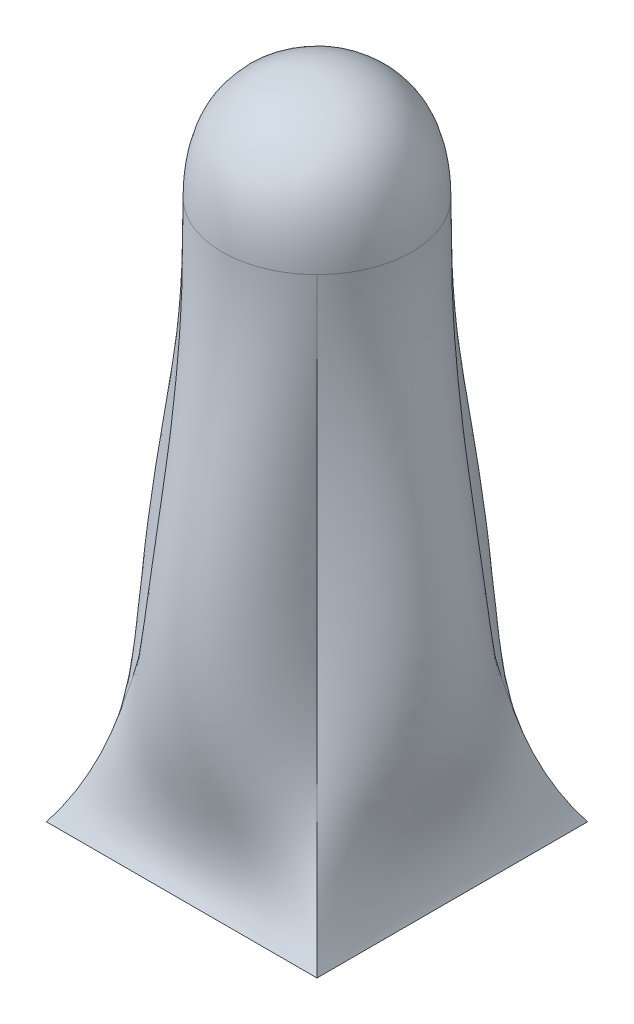
ISO-10303-21;
HEADER;
FILE_DESCRIPTION(('STEP AP214'),'2;1');
FILE_NAME('part.step','',(''),(''),'','','');
FILE_SCHEMA(('AUTOMOTIVE_DESIGN { 1 0 10303 214 1 1 1 1 }'));
ENDSEC;
DATA;
#1=APPLICATION_CONTEXT('core data for automotive mechanical design processes');
#2=APPLICATION_PROTOCOL_DEFINITION('international standard','automotive_design',2000,#1);
#3=PRODUCT_CONTEXT('',#1,'mechanical');
#4=PRODUCT('Part','Part','',(#3));
#5=PRODUCT_RELATED_PRODUCT_CATEGORY('part','',(#4));
#6=PRODUCT_DEFINITION_FORMATION('','',#4);
#7=PRODUCT_DEFINITION_CONTEXT('part definition',#1,'design');
#8=PRODUCT_DEFINITION('design','',#6,#7);
#9=PRODUCT_DEFINITION_SHAPE('','',#8);
#10=(LENGTH_UNIT() NAMED_UNIT(*) SI_UNIT(.MILLI.,.METRE.));
#11=(NAMED_UNIT(*) PLANE_ANGLE_UNIT() SI_UNIT($,.RADIAN.));
#12=(NAMED_UNIT(*) SI_UNIT($,.STERADIAN.) SOLID_ANGLE_UNIT());
#13=UNCERTAINTY_MEASURE_WITH_UNIT(LENGTH_MEASURE(1.E-05),#10,'distance_accuracy_value','');
#14=(GEOMETRIC_REPRESENTATION_CONTEXT(3) GLOBAL_UNCERTAINTY_ASSIGNED_CONTEXT((#13)) GLOBAL_UNIT_ASSIGNED_CONTEXT((#10,
#11,#12)) REPRESENTATION_CONTEXT('',''));
#15=CARTESIAN_POINT('',(0.,0.,0.));
#16=DIRECTION('',(0.,0.,1.));
#17=DIRECTION('',(1.,0.,0.));
#18=AXIS2_PLACEMENT_3D('',#15,#16,#17);
#19=CARTESIAN_POINT('',(0.,0.,0.));
#20=DIRECTION('',(0.,-1.,0.));
#21=DIRECTION('',(0.,0.,-1.));
#22=AXIS2_PLACEMENT_3D('',#19,#20,#21);
#23=PLANE('',#22);
#24=DIRECTION('',(0.,0.,-1.));
#25=VECTOR('',#24,1.);
#26=CARTESIAN_POINT('',(6.35,0.,6.35));
#27=LINE('',#26,#25);
#28=CARTESIAN_POINT('',(6.35,0.,6.35));
#29=VERTEX_POINT('',#28);
#30=CARTESIAN_POINT('',(6.35,0.,-6.35));
#31=VERTEX_POINT('',#30);
#32=EDGE_CURVE('E240',#29,#31,#27,.T.);
#33=ORIENTED_EDGE('',*,*,#32,.F.);
#34=DIRECTION('',(1.,0.,0.));
#35=VECTOR('',#34,1.);
#36=CARTESIAN_POINT('',(-6.35,0.,6.35));
#37=LINE('',#36,#35);
#38=CARTESIAN_POINT('',(-6.35,0.,6.35));
#39=VERTEX_POINT('',#38);
#40=EDGE_CURVE('E223',#39,#29,#37,.T.);
#41=ORIENTED_EDGE('',*,*,#40,.F.);
#42=DIRECTION('',(0.,0.,1.));
#43=VECTOR('',#42,1.);
#44=CARTESIAN_POINT('',(-6.35,0.,6.35));
#45=LINE('',#44,#43);
#46=CARTESIAN_POINT('',(-6.35,0.,-6.35));
#47=VERTEX_POINT('',#46);
#48=EDGE_CURVE('E215',#47,#39,#45,.T.);
#49=ORIENTED_EDGE('',*,*,#48,.F.);
#50=DIRECTION('',(-1.,0.,0.));
#51=VECTOR('',#50,1.);
#52=CARTESIAN_POINT('',(-6.35,0.,-6.35));
#53=LINE('',#52,#51);
#54=EDGE_CURVE('E219',#31,#47,#53,.T.);
#55=ORIENTED_EDGE('',*,*,#54,.F.);
#56=EDGE_LOOP('',(#33,#41,#49,#55));
#57=FACE_BOUND('',#56,.T.);
#58=ADVANCED_FACE('F170',(#57),#23,.T.);
#59=CARTESIAN_POINT('',(6.35,0.,6.35));
#60=CARTESIAN_POINT('',(5.33620582326181,1.5939801367057,5.33620582326182));
#61=CARTESIAN_POINT('',(3.06202655888719,9.88805457372868,3.06202655888719));
#62=CARTESIAN_POINT('',(3.20032044559297,18.527313470039,3.20032044559297));
#63=CARTESIAN_POINT('',(3.14617193349674,25.4,3.14617193349674));
#64=CARTESIAN_POINT('',(6.35,0.,2.11666666666667));
#65=CARTESIAN_POINT('',(5.33620582326182,1.5939801367057,1.77873527442061));
#66=CARTESIAN_POINT('',(10.3210759447851,9.88805457372868,2.52994402734952));
#67=CARTESIAN_POINT('',(4.9367399594886,18.527313470039,1.42780192363319));
#68=CARTESIAN_POINT('',(4.88259144739236,25.4,1.40975241960111));
#69=CARTESIAN_POINT('',(6.35,0.,-2.11666666666667));
#70=CARTESIAN_POINT('',(5.33620582326182,1.5939801367057,-1.77873527442061));
#71=CARTESIAN_POINT('',(10.3210759447851,9.88805457372868,-2.52994402734951));
#72=CARTESIAN_POINT('',(4.9367399594886,18.527313470039,-1.42780192363318));
#73=CARTESIAN_POINT('',(4.88259144739236,25.4,-1.40975241960111));
#74=CARTESIAN_POINT('',(6.35,0.,-6.35));
#75=CARTESIAN_POINT('',(5.33620582326182,1.5939801367057,-5.33620582326181));
#76=CARTESIAN_POINT('',(3.06202655888719,9.88805457372868,-3.06202655888719));
#77=CARTESIAN_POINT('',(3.20032044559297,18.527313470039,-3.20032044559297));
#78=CARTESIAN_POINT('',(3.14617193349674,25.4,-3.14617193349674));
#79=B_SPLINE_SURFACE_WITH_KNOTS('',3,3,((#59,#60,#61,#62,#63),(#64,#65,#66,#67,#68),(#69,#70,
#71,#72,#73),(#74,#75,#76,#77,#78)),.UNSPECIFIED.,.F.,.F.,.F.,(4,4),(4,1,4),(0.,1.),(0.,
0.209240175808596,1.),.UNSPECIFIED.);
#80=CARTESIAN_POINT('',(6.35,0.,-6.35));
#81=CARTESIAN_POINT('',(5.33620582326182,1.5939801367057,-5.33620582326181));
#82=CARTESIAN_POINT('',(3.06202655888719,9.88805457372868,-3.06202655888719));
#83=CARTESIAN_POINT('',(3.20032044559297,18.527313470039,-3.20032044559297));
#84=CARTESIAN_POINT('',(3.14617193349674,25.4,-3.14617193349674));
#85=B_SPLINE_CURVE_WITH_KNOTS('',3,(#80,#81,#82,#83,#84),.UNSPECIFIED.,.F.,.F.,(4,1,4),(0.,
0.209240175808596,1.),.UNSPECIFIED.);
#86=CARTESIAN_POINT('',(3.14617683078582,25.4000267691312,-3.14617682999454));
#87=VERTEX_POINT('',#86);
#88=EDGE_CURVE('E239',#31,#87,#85,.T.);
#89=CARTESIAN_POINT('',(0.,25.4,0.));
#90=DIRECTION('',(0.,1.,0.));
#91=DIRECTION('',(0.,0.,1.));
#92=AXIS2_PLACEMENT_3D('',#89,#90,#91);
#93=CIRCLE('',#92,4.44935901790867);
#94=CARTESIAN_POINT('',(3.14617683013441,25.4000267691422,3.14617683038282));
#95=VERTEX_POINT('',#94);
#96=EDGE_CURVE('E183',#95,#87,#93,.T.);
#97=CARTESIAN_POINT('',(6.35,0.,6.35));
#98=CARTESIAN_POINT('',(5.33620582326181,1.5939801367057,5.33620582326182));
#99=CARTESIAN_POINT('',(3.06202655888719,9.88805457372868,3.06202655888719));
#100=CARTESIAN_POINT('',(3.20032044559297,18.527313470039,3.20032044559297));
#101=CARTESIAN_POINT('',(3.14617193349674,25.4,3.14617193349674));
#102=B_SPLINE_CURVE_WITH_KNOTS('',3,(#97,#98,#99,#100,#101),.UNSPECIFIED.,.F.,.F.,(4,1,4),(0.,
0.209240175808596,1.),.UNSPECIFIED.);
#103=EDGE_CURVE('E249',#95,#29,#102,.F.);
#104=ORIENTED_EDGE('',*,*,#32,.T.);
#105=ORIENTED_EDGE('',*,*,#88,.T.);
#106=ORIENTED_EDGE('',*,*,#96,.F.);
#107=ORIENTED_EDGE('',*,*,#103,.T.);
#108=EDGE_LOOP('',(#104,#105,#106,#107));
#109=FACE_BOUND('',#108,.T.);
#110=ADVANCED_FACE('F302',(#109),#79,.T.);
#111=CARTESIAN_POINT('',(6.35,0.,-6.35));
#112=CARTESIAN_POINT('',(5.33620582326182,1.5939801367057,-5.33620582326181));
#113=CARTESIAN_POINT('',(3.06202655888719,9.88805457372868,-3.06202655888719));
#114=CARTESIAN_POINT('',(3.20032044559297,18.527313470039,-3.20032044559297));
#115=CARTESIAN_POINT('',(3.14617193349674,25.4,-3.14617193349674));
#116=CARTESIAN_POINT('',(2.11666666666667,0.,-6.35));
#117=CARTESIAN_POINT('',(1.77873527442061,1.5939801367057,-5.33620582326182));
#118=CARTESIAN_POINT('',(2.52994402734952,9.88805457372868,-10.3210759447851));
#119=CARTESIAN_POINT('',(1.42780192363319,18.527313470039,-4.9367399594886));
#120=CARTESIAN_POINT('',(1.40975241960111,25.4,-4.88259144739236));
#121=CARTESIAN_POINT('',(-2.11666666666667,0.,-6.35));
#122=CARTESIAN_POINT('',(-1.77873527442061,1.5939801367057,-5.33620582326182));
#123=CARTESIAN_POINT('',(-2.52994402734951,9.88805457372868,-10.3210759447851));
#124=CARTESIAN_POINT('',(-1.42780192363318,18.527313470039,-4.9367399594886));
#125=CARTESIAN_POINT('',(-1.40975241960111,25.4,-4.88259144739236));
#126=CARTESIAN_POINT('',(-6.35,0.,-6.35));
#127=CARTESIAN_POINT('',(-5.33620582326181,1.5939801367057,-5.33620582326182));
#128=CARTESIAN_POINT('',(-3.06202655888719,9.88805457372868,-3.06202655888719));
#129=CARTESIAN_POINT('',(-3.20032044559297,18.527313470039,-3.20032044559297));
#130=CARTESIAN_POINT('',(-3.14617193349674,25.4,-3.14617193349674));
#131=B_SPLINE_SURFACE_WITH_KNOTS('',3,3,((#111,#112,#113,#114,#115),(#116,#117,#118,#119,#120),
(#121,#122,#123,#124,#125),(#126,#127,#128,#129,#130)),.UNSPECIFIED.,.F.,.F.,.F.,(4,4),(4,1,4),
(0.,1.),(0.,0.209240175808596,1.),.UNSPECIFIED.);
#132=CARTESIAN_POINT('',(-6.35,0.,-6.35));
#133=CARTESIAN_POINT('',(-5.33620582326181,1.5939801367057,-5.33620582326182));
#134=CARTESIAN_POINT('',(-3.06202655888719,9.88805457372868,-3.06202655888719));
#135=CARTESIAN_POINT('',(-3.20032044559297,18.527313470039,-3.20032044559297));
#136=CARTESIAN_POINT('',(-3.14617193349674,25.4,-3.14617193349674));
#137=B_SPLINE_CURVE_WITH_KNOTS('',3,(#132,#133,#134,#135,#136),.UNSPECIFIED.,.F.,.F.,(4,1,4),
(0.,0.209240175808596,1.),.UNSPECIFIED.);
#138=CARTESIAN_POINT('',(-3.1461768302483,25.4000267691477,-3.14617683051299));
#139=VERTEX_POINT('',#138);
#140=EDGE_CURVE('E237',#47,#139,#137,.T.);
#141=EDGE_CURVE('E194',#87,#139,#93,.T.);
#142=ORIENTED_EDGE('',*,*,#54,.T.);
#143=ORIENTED_EDGE('',*,*,#140,.T.);
#144=ORIENTED_EDGE('',*,*,#141,.F.);
#145=ORIENTED_EDGE('',*,*,#88,.F.);
#146=EDGE_LOOP('',(#142,#143,#144,#145));
#147=FACE_BOUND('',#146,.T.);
#148=ADVANCED_FACE('F236',(#147),#131,.T.);
#149=CARTESIAN_POINT('',(-6.35,0.,6.35));
#150=CARTESIAN_POINT('',(-5.33620582326182,1.5939801367057,5.33620582326181));
#151=CARTESIAN_POINT('',(-3.06202655888719,9.88805457372868,3.06202655888718));
#152=CARTESIAN_POINT('',(-3.20032044559297,18.527313470039,3.20032044559297));
#153=CARTESIAN_POINT('',(-3.14617193349674,25.4,3.14617193349673));
#154=CARTESIAN_POINT('',(-2.11666666666667,0.,6.35));
#155=CARTESIAN_POINT('',(-1.77873527442061,1.5939801367057,5.33620582326181));
#156=CARTESIAN_POINT('',(-2.52994402734952,9.88805457372868,10.3210759447851));
#157=CARTESIAN_POINT('',(-1.42780192363319,18.527313470039,4.9367399594886));
#158=CARTESIAN_POINT('',(-1.40975241960111,25.4,4.88259144739236));
#159=CARTESIAN_POINT('',(2.11666666666667,0.,6.35));
#160=CARTESIAN_POINT('',(1.7787352744206,1.5939801367057,5.33620582326182));
#161=CARTESIAN_POINT('',(2.52994402734951,9.88805457372868,10.3210759447851));
#162=CARTESIAN_POINT('',(1.42780192363318,18.527313470039,4.9367399594886));
#163=CARTESIAN_POINT('',(1.4097524196011,25.4,4.88259144739237));
#164=CARTESIAN_POINT('',(6.35,0.,6.35));
#165=CARTESIAN_POINT('',(5.33620582326181,1.5939801367057,5.33620582326182));
#166=CARTESIAN_POINT('',(3.06202655888718,9.88805457372868,3.06202655888719));
#167=CARTESIAN_POINT('',(3.20032044559297,18.527313470039,3.20032044559297));
#168=CARTESIAN_POINT('',(3.14617193349673,25.4,3.14617193349674));
#169=B_SPLINE_SURFACE_WITH_KNOTS('',3,3,((#149,#150,#151,#152,#153),(#154,#155,#156,#157,#158),
(#159,#160,#161,#162,#163),(#164,#165,#166,#167,#168)),.UNSPECIFIED.,.F.,.F.,.F.,(4,4),(4,1,4),
(0.,1.),(0.,0.209240175808596,1.),.UNSPECIFIED.);
#170=CARTESIAN_POINT('',(-3.1461768294304,25.4000267691423,3.14617682978572));
#171=VERTEX_POINT('',#170);
#172=EDGE_CURVE('E15',#171,#95,#93,.T.);
#173=CARTESIAN_POINT('',(-6.35,0.,6.35));
#174=CARTESIAN_POINT('',(-5.33620582326182,1.5939801367057,5.33620582326181));
#175=CARTESIAN_POINT('',(-3.06202655888719,9.88805457372868,3.06202655888718));
#176=CARTESIAN_POINT('',(-3.20032044559297,18.527313470039,3.20032044559297));
#177=CARTESIAN_POINT('',(-3.14617193349674,25.4,3.14617193349674));
#178=B_SPLINE_CURVE_WITH_KNOTS('',3,(#173,#174,#175,#176,#177),.UNSPECIFIED.,.F.,.F.,(4,1,4),
(0.,0.209240175808596,1.),.UNSPECIFIED.);
#179=EDGE_CURVE('E246',#39,#171,#178,.T.);
#180=ORIENTED_EDGE('',*,*,#40,.T.);
#181=ORIENTED_EDGE('',*,*,#103,.F.);
#182=ORIENTED_EDGE('',*,*,#172,.F.);
#183=ORIENTED_EDGE('',*,*,#179,.F.);
#184=EDGE_LOOP('',(#180,#181,#182,#183));
#185=FACE_BOUND('',#184,.T.);
#186=ADVANCED_FACE('F275',(#185),#169,.T.);
#187=CARTESIAN_POINT('',(-6.35,0.,-6.35));
#188=CARTESIAN_POINT('',(-5.33620582326181,1.5939801367057,-5.33620582326182));
#189=CARTESIAN_POINT('',(-3.06202655888718,9.88805457372868,-3.06202655888719));
#190=CARTESIAN_POINT('',(-3.20032044559297,18.527313470039,-3.20032044559297));
#191=CARTESIAN_POINT('',(-3.14617193349674,25.4,-3.14617193349674));
#192=CARTESIAN_POINT('',(-6.35,0.,-2.11666666666667));
#193=CARTESIAN_POINT('',(-5.33620582326181,1.5939801367057,-1.77873527442061));
#194=CARTESIAN_POINT('',(-10.3210759447851,9.88805457372868,-2.52994402734952));
#195=CARTESIAN_POINT('',(-4.9367399594886,18.527313470039,-1.42780192363319));
#196=CARTESIAN_POINT('',(-4.88259144739237,25.4,-1.40975241960111));
#197=CARTESIAN_POINT('',(-6.35,0.,2.11666666666667));
#198=CARTESIAN_POINT('',(-5.33620582326182,1.5939801367057,1.7787352744206));
#199=CARTESIAN_POINT('',(-10.3210759447851,9.88805457372868,2.52994402734951));
#200=CARTESIAN_POINT('',(-4.9367399594886,18.527313470039,1.42780192363318));
#201=CARTESIAN_POINT('',(-4.88259144739237,25.4,1.40975241960111));
#202=CARTESIAN_POINT('',(-6.35,0.,6.35));
#203=CARTESIAN_POINT('',(-5.33620582326182,1.5939801367057,5.33620582326181));
#204=CARTESIAN_POINT('',(-3.06202655888719,9.88805457372868,3.06202655888718));
#205=CARTESIAN_POINT('',(-3.20032044559297,18.527313470039,3.20032044559297));
#206=CARTESIAN_POINT('',(-3.14617193349674,25.4,3.14617193349674));
#207=B_SPLINE_SURFACE_WITH_KNOTS('',3,3,((#187,#188,#189,#190,#191),(#192,#193,#194,#195,#196),
(#197,#198,#199,#200,#201),(#202,#203,#204,#205,#206)),.UNSPECIFIED.,.F.,.F.,.F.,(4,4),(4,1,4),
(0.,1.),(0.,0.209240175808596,1.),.UNSPECIFIED.);
#208=EDGE_CURVE('E177',#139,#171,#93,.T.);
#209=ORIENTED_EDGE('',*,*,#48,.T.);
#210=ORIENTED_EDGE('',*,*,#179,.T.);
#211=ORIENTED_EDGE('',*,*,#208,.F.);
#212=ORIENTED_EDGE('',*,*,#140,.F.);
#213=EDGE_LOOP('',(#209,#210,#211,#212));
#214=FACE_BOUND('',#213,.T.);
#215=ADVANCED_FACE('F244',(#214),#207,.T.);
#216=CARTESIAN_POINT('',(-2.63571635753211,19.5828753892292,-2.63571634659866));
#217=CARTESIAN_POINT('',(-3.01446363851196,21.0375837519094,-2.66558888925448));
#218=CARTESIAN_POINT('',(-3.38082537519582,22.2495178577318,-2.55627535288199));
#219=CARTESIAN_POINT('',(-3.72123846089027,23.2192700713253,-2.29759380625307));
#220=CARTESIAN_POINT('',(-4.28154081193393,24.6727328524745,-1.49218698559665));
#221=CARTESIAN_POINT('',(-4.49893551614697,25.1562469990104,-0.315956400193184));
#222=CARTESIAN_POINT('',(-4.49893550161784,25.1562469990673,0.315956399367973));
#223=CARTESIAN_POINT('',(-4.28154082037635,24.6727328525398,1.49218698328808));
#224=CARTESIAN_POINT('',(-3.72123845280063,23.219270071305,2.29759380970014));
#225=CARTESIAN_POINT('',(-3.38082537265706,22.2495178578056,2.55627535587542));
#226=CARTESIAN_POINT('',(-3.0144636243373,21.0375837518864,2.66558889410019));
#227=CARTESIAN_POINT('',(-2.63571634659642,19.5828753892324,2.63571635753475));
#228=CARTESIAN_POINT('',(-2.66558887111666,21.0375837518936,-3.01446362754444));
#229=CARTESIAN_POINT('',(-3.03524919000661,22.4928283722431,-3.03524919286404));
#230=CARTESIAN_POINT('',(-3.39753798685678,23.7050254236933,-2.9068163655664));
#231=CARTESIAN_POINT('',(-3.73996743215384,24.6752079985327,-2.61394396464061));
#232=CARTESIAN_POINT('',(-4.3094722491425,26.1289015451195,-1.69982888039728));
#233=CARTESIAN_POINT('',(-4.52988011264185,26.6122445750053,-0.360115898200909));
#234=CARTESIAN_POINT('',(-4.52988008837564,26.6122445761986,0.360115906801815));
#235=CARTESIAN_POINT('',(-4.30947228303727,26.1289015437874,1.69982885523593));
#236=CARTESIAN_POINT('',(-3.73996742248776,24.6752079993028,2.61394399650983));
#237=CARTESIAN_POINT('',(-3.39753798798957,23.7050254233939,2.90681629321161));
#238=CARTESIAN_POINT('',(-3.0352491948473,22.4928283721281,3.03524922584896));
#239=CARTESIAN_POINT('',(-2.66558887128809,21.0375837519155,3.01446363955607));
#240=CARTESIAN_POINT('',(-2.55627542130764,22.2495178584636,-3.38082535078181));
#241=CARTESIAN_POINT('',(-2.9068165616304,23.7050254222751,-3.39753808439199));
#242=CARTESIAN_POINT('',(-3.25171249541508,24.9166924185225,-3.25171264166076));
#243=CARTESIAN_POINT('',(-3.59595291197397,25.8876998134539,-2.93647743720923));
#244=CARTESIAN_POINT('',(-4.15671979100973,27.3413049146153,-1.91433369870202));
#245=CARTESIAN_POINT('',(-4.36020094326506,27.8244037201999,-0.403752466367272));
#246=CARTESIAN_POINT('',(-4.36020069559326,27.8244037221573,0.403752470477056));
#247=CARTESIAN_POINT('',(-4.15672013209535,27.3413049101537,1.91433377480974));
#248=CARTESIAN_POINT('',(-3.59595269288233,25.8876998167399,2.93647737128983));
#249=CARTESIAN_POINT('',(-3.2517125890703,24.9166924162437,3.25171280018854));
#250=CARTESIAN_POINT('',(-2.90681657633754,23.7050254219753,3.39753809914617));
#251=CARTESIAN_POINT('',(-2.55627541950322,22.2495178580642,3.38082537665477));
#252=CARTESIAN_POINT('',(-2.29759376970773,23.2192700710903,-3.72123846726521));
#253=CARTESIAN_POINT('',(-2.61394393509975,24.6752080000957,-3.73996741260436));
#254=CARTESIAN_POINT('',(-2.93647743979276,25.8876998115578,-3.59595280888815));
#255=CARTESIAN_POINT('',(-3.24218636446633,26.8561655956058,-3.2421863835748));
#256=CARTESIAN_POINT('',(-3.72321543149763,28.3092205784827,-2.10073949195415));
#257=CARTESIAN_POINT('',(-3.90743510616871,28.7919312157352,-0.444770210632441));
#258=CARTESIAN_POINT('',(-3.90743515757607,28.791931209488,0.444770259040186));
#259=CARTESIAN_POINT('',(-3.72321527679238,28.3092205849422,2.10073941814047));
#260=CARTESIAN_POINT('',(-3.24218648794907,26.85616559164,3.24218640757975));
#261=CARTESIAN_POINT('',(-2.9364774551614,25.8876998136355,3.59595265975899));
#262=CARTESIAN_POINT('',(-2.61394385902151,24.6752080006708,3.73996738673725));
#263=CARTESIAN_POINT('',(-2.29759375558198,23.2192700716611,3.7212384442162));
#264=CARTESIAN_POINT('',(-1.49218699658282,24.6727328530573,-4.28154080934795));
#265=CARTESIAN_POINT('',(-1.69982875804696,26.1289015436534,-4.30947227632904));
#266=CARTESIAN_POINT('',(-1.91433390670783,27.3413049164371,-4.15671984320781));
#267=CARTESIAN_POINT('',(-2.10073939941281,28.309220579379,-3.72321543612231));
#268=CARTESIAN_POINT('',(-2.40793524040634,29.7586646856622,-2.40793520145146));
#269=CARTESIAN_POINT('',(-2.52129947978097,30.2403601912782,-0.506275880119534));
#270=CARTESIAN_POINT('',(-2.52129951687365,30.2403601890767,0.506275732791193));
#271=CARTESIAN_POINT('',(-2.40793533271457,29.7586646850519,2.40793536123536));
#272=CARTESIAN_POINT('',(-2.10073924354121,28.3092205824175,3.72321534769196));
#273=CARTESIAN_POINT('',(-1.91433385512057,27.3413049155399,4.15672019892608));
#274=CARTESIAN_POINT('',(-1.69982887116047,26.1289015417208,4.30947224260301));
#275=CARTESIAN_POINT('',(-1.49218702032192,24.6727328520441,4.28154083687311));
#276=CARTESIAN_POINT('',(-0.315956387762986,25.1562469987931,-4.49893550449156));
#277=CARTESIAN_POINT('',(-0.360116019844867,26.6122445754078,-4.52988010004768));
#278=CARTESIAN_POINT('',(-0.403752302160756,27.8244037195724,-4.36020095589391));
#279=CARTESIAN_POINT('',(-0.444770295953633,28.7919312135802,-3.9074350918826));
#280=CARTESIAN_POINT('',(-0.506275866022633,30.2403601922934,-2.52129948298997));
#281=CARTESIAN_POINT('',(-0.53014193107768,30.7203756684273,-0.530141973429982));
#282=CARTESIAN_POINT('',(-0.530141828216963,30.7203756776703,0.530142211672616));
#283=CARTESIAN_POINT('',(-0.506275876181178,30.2403601875966,2.52129933727083));
#284=CARTESIAN_POINT('',(-0.444770417334376,28.7919312125781,3.90743506923858));
#285=CARTESIAN_POINT('',(-0.403752428384167,27.8244037175671,4.36020060575404));
#286=CARTESIAN_POINT('',(-0.360115929889099,26.612244577684,4.52988014556817));
#287=CARTESIAN_POINT('',(-0.315956377152298,25.156246999698,4.49893550297848));
#288=CARTESIAN_POINT('',(0.315956356640557,25.1562469996081,-4.49893550190445));
#289=CARTESIAN_POINT('',(0.360115900973211,26.6122445763524,-4.52988011557448));
#290=CARTESIAN_POINT('',(0.40375252244539,27.8244037222452,-4.36020062649961));
#291=CARTESIAN_POINT('',(0.444770209866895,28.7919312111901,-3.90743521644301));
#292=CARTESIAN_POINT('',(0.506275852267232,30.240360190568,-2.52129942977259));
#293=CARTESIAN_POINT('',(0.530142039947398,30.7203756735384,-0.530141930543628));
#294=CARTESIAN_POINT('',(0.530141701533095,30.7203756696909,0.530141695379244));
#295=CARTESIAN_POINT('',(0.506275953835338,30.2403601910442,2.52129950510851));
#296=CARTESIAN_POINT('',(0.444770391230734,28.791931214932,3.90743532320928));
#297=CARTESIAN_POINT('',(0.403752438506095,27.8244037201876,4.36020083950722));
#298=CARTESIAN_POINT('',(0.360115936315844,26.6122445760243,4.52988010729909));
#299=CARTESIAN_POINT('',(0.315956375218153,25.1562469991314,4.49893547846542));
#300=CARTESIAN_POINT('',(1.49218702744955,24.6727328518482,-4.28154084315204));
#301=CARTESIAN_POINT('',(1.69982886575034,26.1289015441955,-4.309472302356));
#302=CARTESIAN_POINT('',(1.91433374233371,27.3413049098186,-4.15672014159977));
#303=CARTESIAN_POINT('',(2.10073946855765,28.3092205839387,-3.72321526985838));
#304=CARTESIAN_POINT('',(2.40793528644136,29.7586646834489,-2.4079352986663));
#305=CARTESIAN_POINT('',(2.52129941584466,30.2403601908379,-0.506275913285771));
#306=CARTESIAN_POINT('',(2.5212995562584,30.2403601919337,0.506276058708785));
#307=CARTESIAN_POINT('',(2.40793526500707,29.7586646845872,2.40793524349898));
#308=CARTESIAN_POINT('',(2.10073929456722,28.3092205794279,3.72321522731471));
#309=CARTESIAN_POINT('',(1.91433386050954,27.3413049143457,4.15672003655433));
#310=CARTESIAN_POINT('',(1.69982883165529,26.1289015434147,4.30947228413293));
#311=CARTESIAN_POINT('',(1.49218702129662,24.6727328522147,4.28154086695669));
#312=CARTESIAN_POINT('',(2.29759376521147,23.2192700721173,-3.72123842434616));
#313=CARTESIAN_POINT('',(2.61394390955311,24.6752079985184,-3.73996733760066));
#314=CARTESIAN_POINT('',(2.93647746801049,25.8876998171451,-3.59595270201457));
#315=CARTESIAN_POINT('',(3.2421863440847,26.8561655917136,-3.24218645656484));
#316=CARTESIAN_POINT('',(3.72321536820833,28.3092205841279,-2.1007393532284));
#317=CARTESIAN_POINT('',(3.90743511540652,28.7919312107087,-0.444770272715232));
#318=CARTESIAN_POINT('',(3.90743520194594,28.7919312126182,0.44477021787672));
#319=CARTESIAN_POINT('',(3.72321530486026,28.3092205817281,2.10073937698606));
#320=CARTESIAN_POINT('',(3.24218642118275,26.8561655954655,3.24218648327693));
#321=CARTESIAN_POINT('',(2.93647746512105,25.8876998125362,3.59595269563651));
#322=CARTESIAN_POINT('',(2.61394389591704,24.675208000136,3.73996738106524));
#323=CARTESIAN_POINT('',(2.29759375414139,23.2192700720493,3.72123840460533));
#324=CARTESIAN_POINT('',(2.55627540579704,22.2495178576828,-3.38082540469861));
#325=CARTESIAN_POINT('',(2.90681650343063,23.7050254240109,-3.39753821747639));
#326=CARTESIAN_POINT('',(3.25171267007231,24.9166924137348,-3.25171259983495));
#327=CARTESIAN_POINT('',(3.59595277246424,25.8876998165886,-2.93647744043627));
#328=CARTESIAN_POINT('',(4.15672010864594,27.3413049092935,-1.91433378641213));
#329=CARTESIAN_POINT('',(4.36020072091074,27.8244037225355,-0.403752521732888));
#330=CARTESIAN_POINT('',(4.36020081899566,27.8244037230626,0.403752552173919));
#331=CARTESIAN_POINT('',(4.15671999660024,27.3413049100269,1.91433376546061));
#332=CARTESIAN_POINT('',(3.59595279584906,25.8876998135123,2.93647743698136));
#333=CARTESIAN_POINT('',(3.25171255133693,24.9166924182751,3.25171261039848));
#334=CARTESIAN_POINT('',(2.90681656482854,23.7050254219916,3.39753818211784));
#335=CARTESIAN_POINT('',(2.55627542949793,22.2495178574709,3.38082540282505));
#336=CARTESIAN_POINT('',(2.66558887327764,21.0375837518102,-3.01446363828303));
#337=CARTESIAN_POINT('',(3.03524918998767,22.4928283720557,-3.03524912490857));
#338=CARTESIAN_POINT('',(3.39753797488561,23.7050254229387,-2.90681650804187));
#339=CARTESIAN_POINT('',(3.73996742361101,24.6752079988048,-2.61394388899061));
#340=CARTESIAN_POINT('',(4.30947224244075,26.1289015456502,-1.69982887777447));
#341=CARTESIAN_POINT('',(4.52988010848002,26.6122445746537,-0.360115914482894));
#342=CARTESIAN_POINT('',(4.52988009528624,26.6122445748888,0.360115897296604));
#343=CARTESIAN_POINT('',(4.30947225815263,26.1289015453797,1.69982889309774));
#344=CARTESIAN_POINT('',(3.73996743144953,24.6752079993752,2.61394387337055));
#345=CARTESIAN_POINT('',(3.39753798910405,23.7050254226816,2.90681654253496));
#346=CARTESIAN_POINT('',(3.03524919970652,22.492828372259,3.03524910568139));
#347=CARTESIAN_POINT('',(2.66558887652381,21.037583751837,3.01446362704728));
#348=CARTESIAN_POINT('',(2.63571634659339,19.5828753892535,-2.63571635754164));
#349=CARTESIAN_POINT('',(3.01446362377821,21.0375837519789,-2.66558885047418));
#350=CARTESIAN_POINT('',(3.38082536635695,22.2495178583894,-2.55627538048274));
#351=CARTESIAN_POINT('',(3.72123845609067,23.2192700708786,-2.29759377974411));
#352=CARTESIAN_POINT('',(4.28154080517863,24.6727328539608,-1.4921870210616));
#353=CARTESIAN_POINT('',(4.498935507963,25.1562469983199,-0.315956331438885));
#354=CARTESIAN_POINT('',(4.49893552223688,25.1562469985696,0.315956332724804));
#355=CARTESIAN_POINT('',(4.28154079757351,24.6727328536941,1.49218702284416));
#356=CARTESIAN_POINT('',(3.72123846449757,23.2192700710433,2.29759377749981));
#357=CARTESIAN_POINT('',(3.38082537031338,22.2495178582511,2.55627537691795));
#358=CARTESIAN_POINT('',(3.0144636380649,21.0375837519722,2.66558884563294));
#359=CARTESIAN_POINT('',(2.63571635753634,19.5828753892559,2.63571634659962));
#360=B_SPLINE_SURFACE_WITH_KNOTS('',5,5,((#216,#217,#218,#219,#220,#221,#222,#223,#224,#225,
#226,#227),(#228,#229,#230,#231,#232,#233,#234,#235,#236,#237,#238,#239),(#240,#241,#242,#243,
#244,#245,#246,#247,#248,#249,#250,#251),(#252,#253,#254,#255,#256,#257,#258,#259,#260,#261,
#262,#263),(#264,#265,#266,#267,#268,#269,#270,#271,#272,#273,#274,#275),(#276,#277,#278,#279,
#280,#281,#282,#283,#284,#285,#286,#287),(#288,#289,#290,#291,#292,#293,#294,#295,#296,#297,
#298,#299),(#300,#301,#302,#303,#304,#305,#306,#307,#308,#309,#310,#311),(#312,#313,#314,#315,
#316,#317,#318,#319,#320,#321,#322,#323),(#324,#325,#326,#327,#328,#329,#330,#331,#332,#333,
#334,#335),(#336,#337,#338,#339,#340,#341,#342,#343,#344,#345,#346,#347),(#348,#349,#350,#351,
#352,#353,#354,#355,#356,#357,#358,#359)),.UNSPECIFIED.,.F.,.F.,.F.,(6,3,3,6),(6,3,3,6),
(-4.60522799634488,-1.53507599878162,1.53507599878164,4.60522799634489),(-4.60522799634329,
-1.53507599878087,1.53507599878155,4.60522799634397),.UNSPECIFIED.);
#361=ORIENTED_EDGE('',*,*,#172,.T.);
#362=ORIENTED_EDGE('',*,*,#96,.T.);
#363=ORIENTED_EDGE('',*,*,#141,.T.);
#364=ORIENTED_EDGE('',*,*,#208,.T.);
#365=EDGE_LOOP('',(#361,#362,#363,#364));
#366=FACE_BOUND('',#365,.T.);
#367=ADVANCED_FACE('F172',(#366),#360,.F.);
#368=CLOSED_SHELL('',(#58,#110,#148,#186,#215,#367));
#369=MANIFOLD_SOLID_BREP('B2',#368);
#370=ADVANCED_BREP_SHAPE_REPRESENTATION('',(#18,#369),#14);
#371=SHAPE_DEFINITION_REPRESENTATION(#9,#370);
ENDSEC;
END-ISO-10303-21;
